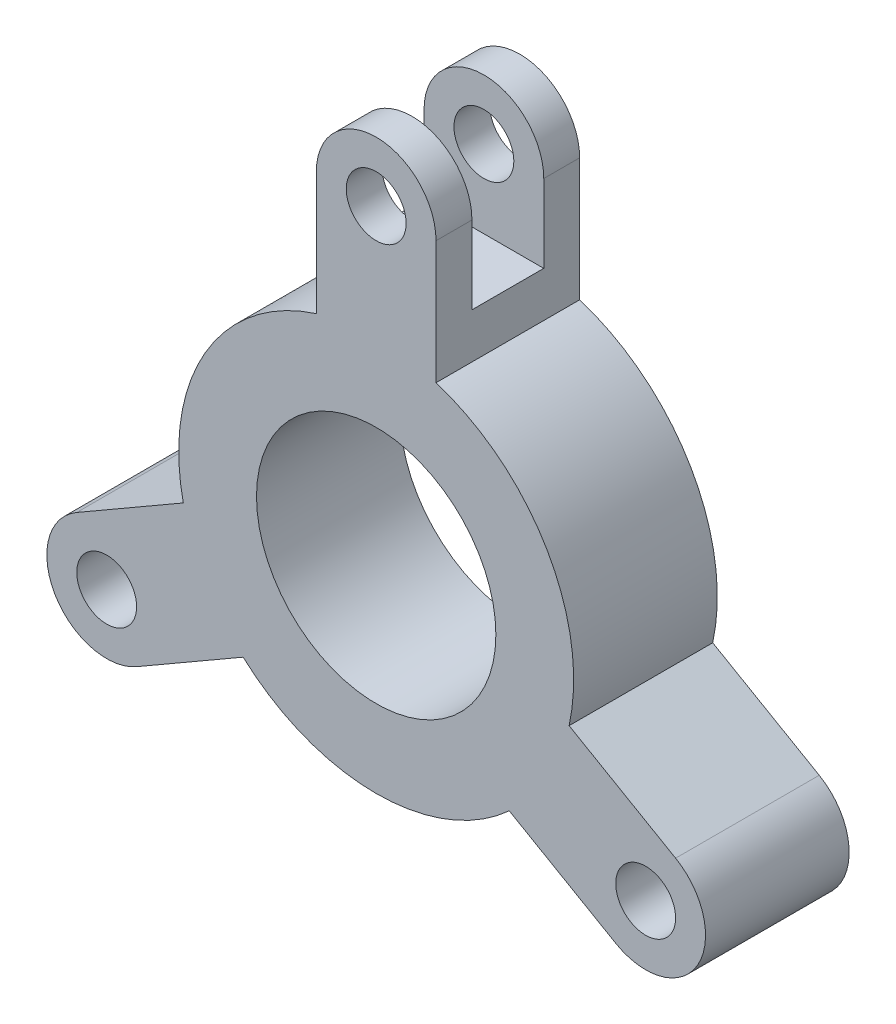
ISO-10303-21;
HEADER;
FILE_DESCRIPTION(('STEP AP214'),'2;1');
FILE_NAME('part.step','',(''),(''),'','','');
FILE_SCHEMA(('AUTOMOTIVE_DESIGN { 1 0 10303 214 1 1 1 1 }'));
ENDSEC;
DATA;
#1=APPLICATION_CONTEXT('core data for automotive mechanical design processes');
#2=APPLICATION_PROTOCOL_DEFINITION('international standard','automotive_design',2000,#1);
#3=PRODUCT_CONTEXT('',#1,'mechanical');
#4=PRODUCT('Part','Part','',(#3));
#5=PRODUCT_RELATED_PRODUCT_CATEGORY('part','',(#4));
#6=PRODUCT_DEFINITION_FORMATION('','',#4);
#7=PRODUCT_DEFINITION_CONTEXT('part definition',#1,'design');
#8=PRODUCT_DEFINITION('design','',#6,#7);
#9=PRODUCT_DEFINITION_SHAPE('','',#8);
#10=(LENGTH_UNIT() NAMED_UNIT(*) SI_UNIT(.MILLI.,.METRE.));
#11=(NAMED_UNIT(*) PLANE_ANGLE_UNIT() SI_UNIT($,.RADIAN.));
#12=(NAMED_UNIT(*) SI_UNIT($,.STERADIAN.) SOLID_ANGLE_UNIT());
#13=UNCERTAINTY_MEASURE_WITH_UNIT(LENGTH_MEASURE(1.E-05),#10,'distance_accuracy_value','');
#14=(GEOMETRIC_REPRESENTATION_CONTEXT(3) GLOBAL_UNCERTAINTY_ASSIGNED_CONTEXT((#13)) GLOBAL_UNIT_ASSIGNED_CONTEXT((#10,
#11,#12)) REPRESENTATION_CONTEXT('',''));
#15=CARTESIAN_POINT('',(0.,0.,0.));
#16=DIRECTION('',(0.,0.,1.));
#17=DIRECTION('',(1.,0.,0.));
#18=AXIS2_PLACEMENT_3D('',#15,#16,#17);
#19=CARTESIAN_POINT('',(-5.,0.,-6.));
#20=DIRECTION('',(1.,0.,0.));
#21=DIRECTION('',(0.,0.,-1.));
#22=AXIS2_PLACEMENT_3D('',#19,#20,#21);
#23=PLANE('',#22);
#24=DIRECTION('',(0.,1.,0.));
#25=VECTOR('',#24,1.);
#26=CARTESIAN_POINT('',(-5.,0.,3.));
#27=LINE('',#26,#25);
#28=CARTESIAN_POINT('',(-5.,19.5,3.));
#29=VERTEX_POINT('',#28);
#30=CARTESIAN_POINT('',(-5.,26.,3.));
#31=VERTEX_POINT('',#30);
#32=EDGE_CURVE('E166',#29,#31,#27,.T.);
#33=ORIENTED_EDGE('',*,*,#32,.F.);
#34=DIRECTION('',(0.,0.,1.));
#35=VECTOR('',#34,1.);
#36=CARTESIAN_POINT('',(-5.,19.5,-6.));
#37=LINE('',#36,#35);
#38=CARTESIAN_POINT('',(-5.,19.5,-3.));
#39=VERTEX_POINT('',#38);
#40=EDGE_CURVE('E159',#39,#29,#37,.T.);
#41=ORIENTED_EDGE('',*,*,#40,.F.);
#42=DIRECTION('',(0.,1.,0.));
#43=VECTOR('',#42,1.);
#44=CARTESIAN_POINT('',(-5.,0.,-3.));
#45=LINE('',#44,#43);
#46=CARTESIAN_POINT('',(-5.,26.,-3.));
#47=VERTEX_POINT('',#46);
#48=EDGE_CURVE('E146',#39,#47,#45,.T.);
#49=ORIENTED_EDGE('',*,*,#48,.T.);
#50=DIRECTION('',(0.,0.,1.));
#51=VECTOR('',#50,1.);
#52=CARTESIAN_POINT('',(-5.,26.,-6.));
#53=LINE('',#52,#51);
#54=CARTESIAN_POINT('',(-5.,26.,-6.));
#55=VERTEX_POINT('',#54);
#56=EDGE_CURVE('E266',#55,#47,#53,.T.);
#57=ORIENTED_EDGE('',*,*,#56,.F.);
#58=DIRECTION('',(0.,1.,0.));
#59=VECTOR('',#58,1.);
#60=CARTESIAN_POINT('',(-5.,0.,-6.));
#61=LINE('',#60,#59);
#62=CARTESIAN_POINT('',(-5.,15.7241851935164,-6.));
#63=VERTEX_POINT('',#62);
#64=EDGE_CURVE('E250',#63,#55,#61,.T.);
#65=ORIENTED_EDGE('',*,*,#64,.F.);
#66=DIRECTION('',(0.,0.,1.));
#67=VECTOR('',#66,1.);
#68=CARTESIAN_POINT('',(-5.,15.7241851935164,-6.));
#69=LINE('',#68,#67);
#70=CARTESIAN_POINT('',(-5.,15.7241851935164,6.));
#71=VERTEX_POINT('',#70);
#72=EDGE_CURVE('E43',#63,#71,#69,.T.);
#73=ORIENTED_EDGE('',*,*,#72,.T.);
#74=DIRECTION('',(0.,1.,0.));
#75=VECTOR('',#74,1.);
#76=CARTESIAN_POINT('',(-5.,0.,6.));
#77=LINE('',#76,#75);
#78=CARTESIAN_POINT('',(-5.,26.,6.));
#79=VERTEX_POINT('',#78);
#80=EDGE_CURVE('E205',#71,#79,#77,.T.);
#81=ORIENTED_EDGE('',*,*,#80,.T.);
#82=EDGE_CURVE('E268',#31,#79,#53,.T.);
#83=ORIENTED_EDGE('',*,*,#82,.F.);
#84=EDGE_LOOP('',(#33,#41,#49,#57,#65,#73,#81,#83));
#85=FACE_BOUND('',#84,.T.);
#86=ADVANCED_FACE('F35',(#85),#23,.F.);
#87=CARTESIAN_POINT('',(0.,26.,-6.));
#88=DIRECTION('',(0.,0.,1.));
#89=DIRECTION('',(1.,0.,0.));
#90=AXIS2_PLACEMENT_3D('',#87,#88,#89);
#91=CYLINDRICAL_SURFACE('',#90,5.);
#92=DIRECTION('',(0.,0.,1.));
#93=VECTOR('',#92,1.);
#94=CARTESIAN_POINT('',(5.,26.,-6.));
#95=LINE('',#94,#93);
#96=CARTESIAN_POINT('',(5.,26.,3.));
#97=VERTEX_POINT('',#96);
#98=CARTESIAN_POINT('',(5.,26.,6.));
#99=VERTEX_POINT('',#98);
#100=EDGE_CURVE('E272',#97,#99,#95,.T.);
#101=ORIENTED_EDGE('',*,*,#100,.F.);
#102=CARTESIAN_POINT('',(0.,26.,3.));
#103=DIRECTION('',(0.,0.,-1.));
#104=DIRECTION('',(-1.,0.,0.));
#105=AXIS2_PLACEMENT_3D('',#102,#103,#104);
#106=CIRCLE('',#105,5.);
#107=EDGE_CURVE('E172',#97,#31,#106,.F.);
#108=ORIENTED_EDGE('',*,*,#107,.T.);
#109=ORIENTED_EDGE('',*,*,#82,.T.);
#110=CARTESIAN_POINT('',(0.,26.,6.));
#111=DIRECTION('',(0.,0.,1.));
#112=DIRECTION('',(1.,0.,0.));
#113=AXIS2_PLACEMENT_3D('',#110,#111,#112);
#114=CIRCLE('',#113,5.);
#115=EDGE_CURVE('E202',#99,#79,#114,.T.);
#116=ORIENTED_EDGE('',*,*,#115,.F.);
#117=EDGE_LOOP('',(#101,#108,#109,#116));
#118=FACE_BOUND('',#117,.T.);
#119=ADVANCED_FACE('F326',(#118),#91,.T.);
#120=CARTESIAN_POINT('',(5.,0.,-6.));
#121=DIRECTION('',(1.,0.,0.));
#122=DIRECTION('',(0.,0.,-1.));
#123=AXIS2_PLACEMENT_3D('',#120,#121,#122);
#124=PLANE('',#123);
#125=DIRECTION('',(0.,0.,1.));
#126=VECTOR('',#125,1.);
#127=CARTESIAN_POINT('',(5.,19.5,-6.));
#128=LINE('',#127,#126);
#129=CARTESIAN_POINT('',(5.,19.5,-3.));
#130=VERTEX_POINT('',#129);
#131=CARTESIAN_POINT('',(5.,19.5,3.));
#132=VERTEX_POINT('',#131);
#133=EDGE_CURVE('E11',#130,#132,#128,.T.);
#134=ORIENTED_EDGE('',*,*,#133,.T.);
#135=DIRECTION('',(0.,1.,0.));
#136=VECTOR('',#135,1.);
#137=CARTESIAN_POINT('',(5.,0.,3.));
#138=LINE('',#137,#136);
#139=EDGE_CURVE('E294',#132,#97,#138,.T.);
#140=ORIENTED_EDGE('',*,*,#139,.T.);
#141=ORIENTED_EDGE('',*,*,#100,.T.);
#142=DIRECTION('',(0.,1.,0.));
#143=VECTOR('',#142,1.);
#144=CARTESIAN_POINT('',(5.,0.,6.));
#145=LINE('',#144,#143);
#146=CARTESIAN_POINT('',(5.,15.7241851935164,6.));
#147=VERTEX_POINT('',#146);
#148=EDGE_CURVE('E199',#147,#99,#145,.T.);
#149=ORIENTED_EDGE('',*,*,#148,.F.);
#150=DIRECTION('',(0.,0.,1.));
#151=VECTOR('',#150,1.);
#152=CARTESIAN_POINT('',(5.,15.7241851935164,-6.));
#153=LINE('',#152,#151);
#154=CARTESIAN_POINT('',(5.,15.7241851935164,-6.));
#155=VERTEX_POINT('',#154);
#156=EDGE_CURVE('E273',#155,#147,#153,.T.);
#157=ORIENTED_EDGE('',*,*,#156,.F.);
#158=DIRECTION('',(0.,1.,0.));
#159=VECTOR('',#158,1.);
#160=CARTESIAN_POINT('',(5.,0.,-6.));
#161=LINE('',#160,#159);
#162=CARTESIAN_POINT('',(5.,26.,-6.));
#163=VERTEX_POINT('',#162);
#164=EDGE_CURVE('E244',#155,#163,#161,.T.);
#165=ORIENTED_EDGE('',*,*,#164,.T.);
#166=CARTESIAN_POINT('',(5.,26.,-3.));
#167=VERTEX_POINT('',#166);
#168=EDGE_CURVE('E269',#163,#167,#95,.T.);
#169=ORIENTED_EDGE('',*,*,#168,.T.);
#170=DIRECTION('',(0.,1.,0.));
#171=VECTOR('',#170,1.);
#172=CARTESIAN_POINT('',(5.,0.,-3.));
#173=LINE('',#172,#171);
#174=EDGE_CURVE('E292',#130,#167,#173,.T.);
#175=ORIENTED_EDGE('',*,*,#174,.F.);
#176=EDGE_LOOP('',(#134,#140,#141,#149,#157,#165,#169,#175));
#177=FACE_BOUND('',#176,.T.);
#178=ADVANCED_FACE('F306',(#177),#124,.T.);
#179=CARTESIAN_POINT('',(0.,26.,-6.));
#180=DIRECTION('',(0.,0.,1.));
#181=DIRECTION('',(1.,0.,0.));
#182=AXIS2_PLACEMENT_3D('',#179,#180,#181);
#183=CYLINDRICAL_SURFACE('',#182,2.5);
#184=CARTESIAN_POINT('',(0.,26.,6.));
#185=DIRECTION('',(0.,0.,1.));
#186=DIRECTION('',(1.,0.,0.));
#187=AXIS2_PLACEMENT_3D('',#184,#185,#186);
#188=CIRCLE('',#187,2.5);
#189=CARTESIAN_POINT('',(2.5,26.,6.));
#190=VERTEX_POINT('',#189);
#191=EDGE_CURVE('E211',#190,#190,#188,.T.);
#192=ORIENTED_EDGE('',*,*,#191,.T.);
#193=EDGE_LOOP('',(#192));
#194=FACE_BOUND('',#193,.T.);
#195=CARTESIAN_POINT('',(0.,26.,3.));
#196=DIRECTION('',(0.,0.,-1.));
#197=DIRECTION('',(-1.,0.,0.));
#198=AXIS2_PLACEMENT_3D('',#195,#196,#197);
#199=CIRCLE('',#198,2.5);
#200=CARTESIAN_POINT('',(-2.5,26.,3.));
#201=VERTEX_POINT('',#200);
#202=EDGE_CURVE('E154',#201,#201,#199,.F.);
#203=ORIENTED_EDGE('',*,*,#202,.F.);
#204=EDGE_LOOP('',(#203));
#205=FACE_BOUND('',#204,.T.);
#206=ADVANCED_FACE('F351',(#194,#205),#183,.F.);
#207=CARTESIAN_POINT('',(0.,0.,-6.));
#208=DIRECTION('',(0.,0.,1.));
#209=DIRECTION('',(1.,0.,0.));
#210=AXIS2_PLACEMENT_3D('',#207,#208,#209);
#211=CYLINDRICAL_SURFACE('',#210,16.5);
#212=DIRECTION('',(0.,0.,1.));
#213=VECTOR('',#212,1.);
#214=CARTESIAN_POINT('',(-16.1175438313963,-3.531965577836,-6.));
#215=LINE('',#214,#213);
#216=CARTESIAN_POINT('',(-16.1175438313963,-3.531965577836,-6.));
#217=VERTEX_POINT('',#216);
#218=CARTESIAN_POINT('',(-16.1175438313963,-3.531965577836,6.));
#219=VERTEX_POINT('',#218);
#220=EDGE_CURVE('E264',#217,#219,#215,.T.);
#221=ORIENTED_EDGE('',*,*,#220,.T.);
#222=CARTESIAN_POINT('',(0.,0.,6.));
#223=DIRECTION('',(0.,0.,1.));
#224=DIRECTION('',(1.,0.,0.));
#225=AXIS2_PLACEMENT_3D('',#222,#223,#224);
#226=CIRCLE('',#225,16.5);
#227=EDGE_CURVE('E167',#71,#219,#226,.T.);
#228=ORIENTED_EDGE('',*,*,#227,.F.);
#229=ORIENTED_EDGE('',*,*,#72,.F.);
#230=CARTESIAN_POINT('',(0.,0.,-6.));
#231=DIRECTION('',(0.,0.,1.));
#232=DIRECTION('',(1.,0.,0.));
#233=AXIS2_PLACEMENT_3D('',#230,#231,#232);
#234=CIRCLE('',#233,16.5);
#235=EDGE_CURVE('E220',#63,#217,#234,.T.);
#236=ORIENTED_EDGE('',*,*,#235,.T.);
#237=EDGE_LOOP('',(#221,#228,#229,#236));
#238=FACE_BOUND('',#237,.T.);
#239=ADVANCED_FACE('F37',(#238),#211,.T.);
#240=CARTESIAN_POINT('',(0.,26.,-3.));
#241=DIRECTION('',(0.,0.,-1.));
#242=DIRECTION('',(-1.,0.,0.));
#243=AXIS2_PLACEMENT_3D('',#240,#241,#242);
#244=CIRCLE('',#243,5.);
#245=EDGE_CURVE('E149',#167,#47,#244,.F.);
#246=ORIENTED_EDGE('',*,*,#245,.F.);
#247=ORIENTED_EDGE('',*,*,#168,.F.);
#248=CARTESIAN_POINT('',(0.,26.,-6.));
#249=DIRECTION('',(0.,0.,1.));
#250=DIRECTION('',(1.,0.,0.));
#251=AXIS2_PLACEMENT_3D('',#248,#249,#250);
#252=CIRCLE('',#251,5.);
#253=EDGE_CURVE('E247',#163,#55,#252,.T.);
#254=ORIENTED_EDGE('',*,*,#253,.T.);
#255=ORIENTED_EDGE('',*,*,#56,.T.);
#256=EDGE_LOOP('',(#246,#247,#254,#255));
#257=FACE_BOUND('',#256,.T.);
#258=ADVANCED_FACE('F308',(#257),#91,.T.);
#259=CARTESIAN_POINT('',(0.,0.,-6.));
#260=DIRECTION('',(0.,0.,1.));
#261=DIRECTION('',(1.,0.,0.));
#262=AXIS2_PLACEMENT_3D('',#259,#260,#261);
#263=CYLINDRICAL_SURFACE('',#262,16.5);
#264=ORIENTED_EDGE('',*,*,#156,.T.);
#265=CARTESIAN_POINT('',(0.,0.,6.));
#266=DIRECTION('',(0.,0.,1.));
#267=DIRECTION('',(1.,0.,0.));
#268=AXIS2_PLACEMENT_3D('',#265,#266,#267);
#269=CIRCLE('',#268,16.5);
#270=CARTESIAN_POINT('',(16.1175438313963,-3.53196557783599,6.));
#271=VERTEX_POINT('',#270);
#272=EDGE_CURVE('E196',#271,#147,#269,.T.);
#273=ORIENTED_EDGE('',*,*,#272,.F.);
#274=DIRECTION('',(0.,0.,1.));
#275=VECTOR('',#274,1.);
#276=CARTESIAN_POINT('',(16.1175438313963,-3.53196557783599,-6.));
#277=LINE('',#276,#275);
#278=CARTESIAN_POINT('',(16.1175438313963,-3.53196557783599,-6.));
#279=VERTEX_POINT('',#278);
#280=EDGE_CURVE('E275',#279,#271,#277,.T.);
#281=ORIENTED_EDGE('',*,*,#280,.F.);
#282=CARTESIAN_POINT('',(0.,0.,-6.));
#283=DIRECTION('',(0.,0.,1.));
#284=DIRECTION('',(1.,0.,0.));
#285=AXIS2_PLACEMENT_3D('',#282,#283,#284);
#286=CIRCLE('',#285,16.5);
#287=EDGE_CURVE('E241',#279,#155,#286,.T.);
#288=ORIENTED_EDGE('',*,*,#287,.T.);
#289=EDGE_LOOP('',(#264,#273,#281,#288));
#290=FACE_BOUND('',#289,.T.);
#291=ADVANCED_FACE('F348',(#290),#263,.T.);
#292=CARTESIAN_POINT('',(2.5,4.3301270189222,-6.));
#293=DIRECTION('',(-0.5,-0.866025403784439,0.));
#294=DIRECTION('',(0.866025403784439,-0.5,0.));
#295=AXIS2_PLACEMENT_3D('',#292,#293,#294);
#296=PLANE('',#295);
#297=ORIENTED_EDGE('',*,*,#280,.T.);
#298=DIRECTION('',(0.866025403784439,-0.5,0.));
#299=VECTOR('',#298,1.);
#300=CARTESIAN_POINT('',(2.5,4.3301270189222,6.));
#301=LINE('',#300,#299);
#302=CARTESIAN_POINT('',(25.0166604983954,-8.6698729810778,6.));
#303=VERTEX_POINT('',#302);
#304=EDGE_CURVE('E193',#271,#303,#301,.T.);
#305=ORIENTED_EDGE('',*,*,#304,.T.);
#306=DIRECTION('',(0.,0.,1.));
#307=VECTOR('',#306,1.);
#308=CARTESIAN_POINT('',(25.0166604983954,-8.6698729810778,-6.));
#309=LINE('',#308,#307);
#310=CARTESIAN_POINT('',(25.0166604983954,-8.6698729810778,-6.));
#311=VERTEX_POINT('',#310);
#312=EDGE_CURVE('E277',#311,#303,#309,.T.);
#313=ORIENTED_EDGE('',*,*,#312,.F.);
#314=DIRECTION('',(0.866025403784439,-0.5,0.));
#315=VECTOR('',#314,1.);
#316=CARTESIAN_POINT('',(2.5,4.3301270189222,-6.));
#317=LINE('',#316,#315);
#318=EDGE_CURVE('E239',#279,#311,#317,.T.);
#319=ORIENTED_EDGE('',*,*,#318,.F.);
#320=EDGE_LOOP('',(#297,#305,#313,#319));
#321=FACE_BOUND('',#320,.T.);
#322=ADVANCED_FACE('F354',(#321),#296,.F.);
#323=CARTESIAN_POINT('',(22.5166604983954,-13.,-6.));
#324=DIRECTION('',(0.,0.,1.));
#325=DIRECTION('',(1.,0.,0.));
#326=AXIS2_PLACEMENT_3D('',#323,#324,#325);
#327=CYLINDRICAL_SURFACE('',#326,5.);
#328=ORIENTED_EDGE('',*,*,#312,.T.);
#329=CARTESIAN_POINT('',(22.5166604983954,-13.,6.));
#330=DIRECTION('',(0.,0.,1.));
#331=DIRECTION('',(1.,0.,0.));
#332=AXIS2_PLACEMENT_3D('',#329,#330,#331);
#333=CIRCLE('',#332,5.);
#334=CARTESIAN_POINT('',(20.0166604983954,-17.3301270189222,6.));
#335=VERTEX_POINT('',#334);
#336=EDGE_CURVE('E190',#335,#303,#333,.T.);
#337=ORIENTED_EDGE('',*,*,#336,.F.);
#338=DIRECTION('',(0.,0.,1.));
#339=VECTOR('',#338,1.);
#340=CARTESIAN_POINT('',(20.0166604983954,-17.3301270189222,-6.));
#341=LINE('',#340,#339);
#342=CARTESIAN_POINT('',(20.0166604983954,-17.3301270189222,-6.));
#343=VERTEX_POINT('',#342);
#344=EDGE_CURVE('E279',#343,#335,#341,.T.);
#345=ORIENTED_EDGE('',*,*,#344,.F.);
#346=CARTESIAN_POINT('',(22.5166604983954,-13.,-6.));
#347=DIRECTION('',(0.,0.,1.));
#348=DIRECTION('',(1.,0.,0.));
#349=AXIS2_PLACEMENT_3D('',#346,#347,#348);
#350=CIRCLE('',#349,5.);
#351=EDGE_CURVE('E236',#343,#311,#350,.T.);
#352=ORIENTED_EDGE('',*,*,#351,.T.);
#353=EDGE_LOOP('',(#328,#337,#345,#352));
#354=FACE_BOUND('',#353,.T.);
#355=ADVANCED_FACE('F358',(#354),#327,.T.);
#356=CARTESIAN_POINT('',(-2.5,-4.33012701892219,-6.));
#357=DIRECTION('',(-0.5,-0.866025403784439,0.));
#358=DIRECTION('',(0.866025403784439,-0.5,0.));
#359=AXIS2_PLACEMENT_3D('',#356,#357,#358);
#360=PLANE('',#359);
#361=ORIENTED_EDGE('',*,*,#344,.T.);
#362=DIRECTION('',(0.866025403784439,-0.5,0.));
#363=VECTOR('',#362,1.);
#364=CARTESIAN_POINT('',(-2.5,-4.33012701892219,6.));
#365=LINE('',#364,#363);
#366=CARTESIAN_POINT('',(11.1175438313963,-12.1922196156804,6.));
#367=VERTEX_POINT('',#366);
#368=EDGE_CURVE('E187',#367,#335,#365,.T.);
#369=ORIENTED_EDGE('',*,*,#368,.F.);
#370=DIRECTION('',(0.,0.,1.));
#371=VECTOR('',#370,1.);
#372=CARTESIAN_POINT('',(11.1175438313963,-12.1922196156804,-6.));
#373=LINE('',#372,#371);
#374=CARTESIAN_POINT('',(11.1175438313963,-12.1922196156804,-6.));
#375=VERTEX_POINT('',#374);
#376=EDGE_CURVE('E281',#375,#367,#373,.T.);
#377=ORIENTED_EDGE('',*,*,#376,.F.);
#378=DIRECTION('',(0.866025403784439,-0.5,0.));
#379=VECTOR('',#378,1.);
#380=CARTESIAN_POINT('',(-2.5,-4.33012701892219,-6.));
#381=LINE('',#380,#379);
#382=EDGE_CURVE('E233',#375,#343,#381,.T.);
#383=ORIENTED_EDGE('',*,*,#382,.T.);
#384=EDGE_LOOP('',(#361,#369,#377,#383));
#385=FACE_BOUND('',#384,.T.);
#386=ADVANCED_FACE('F362',(#385),#360,.T.);
#387=CARTESIAN_POINT('',(0.,0.,-6.));
#388=DIRECTION('',(0.,0.,1.));
#389=DIRECTION('',(1.,0.,0.));
#390=AXIS2_PLACEMENT_3D('',#387,#388,#389);
#391=CYLINDRICAL_SURFACE('',#390,16.5);
#392=ORIENTED_EDGE('',*,*,#376,.T.);
#393=CARTESIAN_POINT('',(0.,0.,6.));
#394=DIRECTION('',(0.,0.,1.));
#395=DIRECTION('',(1.,0.,0.));
#396=AXIS2_PLACEMENT_3D('',#393,#394,#395);
#397=CIRCLE('',#396,16.5);
#398=CARTESIAN_POINT('',(-11.1175438313963,-12.1922196156804,6.));
#399=VERTEX_POINT('',#398);
#400=EDGE_CURVE('E184',#399,#367,#397,.T.);
#401=ORIENTED_EDGE('',*,*,#400,.F.);
#402=DIRECTION('',(0.,0.,1.));
#403=VECTOR('',#402,1.);
#404=CARTESIAN_POINT('',(-11.1175438313963,-12.1922196156804,-6.));
#405=LINE('',#404,#403);
#406=CARTESIAN_POINT('',(-11.1175438313963,-12.1922196156804,-6.));
#407=VERTEX_POINT('',#406);
#408=EDGE_CURVE('E283',#407,#399,#405,.T.);
#409=ORIENTED_EDGE('',*,*,#408,.F.);
#410=CARTESIAN_POINT('',(0.,0.,-6.));
#411=DIRECTION('',(0.,0.,1.));
#412=DIRECTION('',(1.,0.,0.));
#413=AXIS2_PLACEMENT_3D('',#410,#411,#412);
#414=CIRCLE('',#413,16.5);
#415=EDGE_CURVE('E230',#407,#375,#414,.T.);
#416=ORIENTED_EDGE('',*,*,#415,.T.);
#417=EDGE_LOOP('',(#392,#401,#409,#416));
#418=FACE_BOUND('',#417,.T.);
#419=ADVANCED_FACE('F366',(#418),#391,.T.);
#420=CARTESIAN_POINT('',(2.5,-4.3301270189222,-6.));
#421=DIRECTION('',(-0.5,0.866025403784439,0.));
#422=DIRECTION('',(-0.866025403784439,-0.5,0.));
#423=AXIS2_PLACEMENT_3D('',#420,#421,#422);
#424=PLANE('',#423);
#425=ORIENTED_EDGE('',*,*,#408,.T.);
#426=DIRECTION('',(-0.866025403784439,-0.5,0.));
#427=VECTOR('',#426,1.);
#428=CARTESIAN_POINT('',(2.5,-4.3301270189222,6.));
#429=LINE('',#428,#427);
#430=CARTESIAN_POINT('',(-20.0166604983954,-17.3301270189222,6.));
#431=VERTEX_POINT('',#430);
#432=EDGE_CURVE('E181',#399,#431,#429,.T.);
#433=ORIENTED_EDGE('',*,*,#432,.T.);
#434=DIRECTION('',(0.,0.,1.));
#435=VECTOR('',#434,1.);
#436=CARTESIAN_POINT('',(-20.0166604983954,-17.3301270189222,-6.));
#437=LINE('',#436,#435);
#438=CARTESIAN_POINT('',(-20.0166604983954,-17.3301270189222,-6.));
#439=VERTEX_POINT('',#438);
#440=EDGE_CURVE('E285',#439,#431,#437,.T.);
#441=ORIENTED_EDGE('',*,*,#440,.F.);
#442=DIRECTION('',(-0.866025403784439,-0.5,0.));
#443=VECTOR('',#442,1.);
#444=CARTESIAN_POINT('',(2.5,-4.3301270189222,-6.));
#445=LINE('',#444,#443);
#446=EDGE_CURVE('E228',#407,#439,#445,.T.);
#447=ORIENTED_EDGE('',*,*,#446,.F.);
#448=EDGE_LOOP('',(#425,#433,#441,#447));
#449=FACE_BOUND('',#448,.T.);
#450=ADVANCED_FACE('F370',(#449),#424,.F.);
#451=CARTESIAN_POINT('',(-22.5166604983954,-13.,-6.));
#452=DIRECTION('',(0.,0.,1.));
#453=DIRECTION('',(1.,0.,0.));
#454=AXIS2_PLACEMENT_3D('',#451,#452,#453);
#455=CYLINDRICAL_SURFACE('',#454,5.);
#456=ORIENTED_EDGE('',*,*,#440,.T.);
#457=CARTESIAN_POINT('',(-22.5166604983954,-13.,6.));
#458=DIRECTION('',(0.,0.,1.));
#459=DIRECTION('',(1.,0.,0.));
#460=AXIS2_PLACEMENT_3D('',#457,#458,#459);
#461=CIRCLE('',#460,5.);
#462=CARTESIAN_POINT('',(-25.0166604983954,-8.6698729810778,6.));
#463=VERTEX_POINT('',#462);
#464=EDGE_CURVE('E178',#463,#431,#461,.T.);
#465=ORIENTED_EDGE('',*,*,#464,.F.);
#466=DIRECTION('',(0.,0.,1.));
#467=VECTOR('',#466,1.);
#468=CARTESIAN_POINT('',(-25.0166604983954,-8.6698729810778,-6.));
#469=LINE('',#468,#467);
#470=CARTESIAN_POINT('',(-25.0166604983954,-8.6698729810778,-6.));
#471=VERTEX_POINT('',#470);
#472=EDGE_CURVE('E287',#471,#463,#469,.T.);
#473=ORIENTED_EDGE('',*,*,#472,.F.);
#474=CARTESIAN_POINT('',(-22.5166604983954,-13.,-6.));
#475=DIRECTION('',(0.,0.,1.));
#476=DIRECTION('',(1.,0.,0.));
#477=AXIS2_PLACEMENT_3D('',#474,#475,#476);
#478=CIRCLE('',#477,5.);
#479=EDGE_CURVE('E225',#471,#439,#478,.T.);
#480=ORIENTED_EDGE('',*,*,#479,.T.);
#481=EDGE_LOOP('',(#456,#465,#473,#480));
#482=FACE_BOUND('',#481,.T.);
#483=ADVANCED_FACE('F374',(#482),#455,.T.);
#484=CARTESIAN_POINT('',(22.5166604983954,-13.,-6.));
#485=DIRECTION('',(0.,0.,1.));
#486=DIRECTION('',(1.,0.,0.));
#487=AXIS2_PLACEMENT_3D('',#484,#485,#486);
#488=CYLINDRICAL_SURFACE('',#487,2.5);
#489=CARTESIAN_POINT('',(22.5166604983954,-13.,-6.));
#490=DIRECTION('',(0.,0.,1.));
#491=DIRECTION('',(1.,0.,0.));
#492=AXIS2_PLACEMENT_3D('',#489,#490,#491);
#493=CIRCLE('',#492,2.5);
#494=CARTESIAN_POINT('',(25.0166604983954,-13.,-6.));
#495=VERTEX_POINT('',#494);
#496=EDGE_CURVE('E258',#495,#495,#493,.T.);
#497=ORIENTED_EDGE('',*,*,#496,.F.);
#498=EDGE_LOOP('',(#497));
#499=FACE_BOUND('',#498,.T.);
#500=CARTESIAN_POINT('',(22.5166604983954,-13.,6.));
#501=DIRECTION('',(0.,0.,1.));
#502=DIRECTION('',(1.,0.,0.));
#503=AXIS2_PLACEMENT_3D('',#500,#501,#502);
#504=CIRCLE('',#503,2.5);
#505=CARTESIAN_POINT('',(25.0166604983954,-13.,6.));
#506=VERTEX_POINT('',#505);
#507=EDGE_CURVE('E214',#506,#506,#504,.T.);
#508=ORIENTED_EDGE('',*,*,#507,.T.);
#509=EDGE_LOOP('',(#508));
#510=FACE_BOUND('',#509,.T.);
#511=ADVANCED_FACE('F377',(#499,#510),#488,.F.);
#512=CARTESIAN_POINT('',(0.,26.,-3.));
#513=DIRECTION('',(0.,0.,-1.));
#514=DIRECTION('',(-1.,0.,0.));
#515=AXIS2_PLACEMENT_3D('',#512,#513,#514);
#516=CIRCLE('',#515,2.5);
#517=CARTESIAN_POINT('',(-2.5,26.,-3.));
#518=VERTEX_POINT('',#517);
#519=EDGE_CURVE('E290',#518,#518,#516,.F.);
#520=ORIENTED_EDGE('',*,*,#519,.T.);
#521=EDGE_LOOP('',(#520));
#522=FACE_BOUND('',#521,.T.);
#523=CARTESIAN_POINT('',(0.,26.,-6.));
#524=DIRECTION('',(0.,0.,1.));
#525=DIRECTION('',(1.,0.,0.));
#526=AXIS2_PLACEMENT_3D('',#523,#524,#525);
#527=CIRCLE('',#526,2.5);
#528=CARTESIAN_POINT('',(2.5,26.,-6.));
#529=VERTEX_POINT('',#528);
#530=EDGE_CURVE('E255',#529,#529,#527,.T.);
#531=ORIENTED_EDGE('',*,*,#530,.F.);
#532=EDGE_LOOP('',(#531));
#533=FACE_BOUND('',#532,.T.);
#534=ADVANCED_FACE('F387',(#522,#533),#183,.F.);
#535=CARTESIAN_POINT('',(0.,0.,-6.));
#536=DIRECTION('',(0.,0.,1.));
#537=DIRECTION('',(1.,0.,0.));
#538=AXIS2_PLACEMENT_3D('',#535,#536,#537);
#539=CYLINDRICAL_SURFACE('',#538,10.);
#540=CARTESIAN_POINT('',(0.,0.,-6.));
#541=DIRECTION('',(0.,0.,1.));
#542=DIRECTION('',(1.,0.,0.));
#543=AXIS2_PLACEMENT_3D('',#540,#541,#542);
#544=CIRCLE('',#543,10.);
#545=CARTESIAN_POINT('',(10.,0.,-6.));
#546=VERTEX_POINT('',#545);
#547=EDGE_CURVE('E252',#546,#546,#544,.T.);
#548=ORIENTED_EDGE('',*,*,#547,.F.);
#549=EDGE_LOOP('',(#548));
#550=FACE_BOUND('',#549,.T.);
#551=CARTESIAN_POINT('',(0.,0.,6.));
#552=DIRECTION('',(0.,0.,1.));
#553=DIRECTION('',(1.,0.,0.));
#554=AXIS2_PLACEMENT_3D('',#551,#552,#553);
#555=CIRCLE('',#554,10.);
#556=CARTESIAN_POINT('',(10.,0.,6.));
#557=VERTEX_POINT('',#556);
#558=EDGE_CURVE('E208',#557,#557,#555,.T.);
#559=ORIENTED_EDGE('',*,*,#558,.T.);
#560=EDGE_LOOP('',(#559));
#561=FACE_BOUND('',#560,.T.);
#562=ADVANCED_FACE('F344',(#550,#561),#539,.F.);
#563=CARTESIAN_POINT('',(-2.5,4.33012701892219,-6.));
#564=DIRECTION('',(-0.5,0.866025403784439,0.));
#565=DIRECTION('',(-0.866025403784439,-0.5,0.));
#566=AXIS2_PLACEMENT_3D('',#563,#564,#565);
#567=PLANE('',#566);
#568=ORIENTED_EDGE('',*,*,#472,.T.);
#569=DIRECTION('',(-0.866025403784439,-0.5,0.));
#570=VECTOR('',#569,1.);
#571=CARTESIAN_POINT('',(-2.5,4.33012701892219,6.));
#572=LINE('',#571,#570);
#573=EDGE_CURVE('E170',#219,#463,#572,.T.);
#574=ORIENTED_EDGE('',*,*,#573,.F.);
#575=ORIENTED_EDGE('',*,*,#220,.F.);
#576=DIRECTION('',(-0.866025403784439,-0.5,0.));
#577=VECTOR('',#576,1.);
#578=CARTESIAN_POINT('',(-2.5,4.33012701892219,-6.));
#579=LINE('',#578,#577);
#580=EDGE_CURVE('E222',#217,#471,#579,.T.);
#581=ORIENTED_EDGE('',*,*,#580,.T.);
#582=EDGE_LOOP('',(#568,#574,#575,#581));
#583=FACE_BOUND('',#582,.T.);
#584=ADVANCED_FACE('F319',(#583),#567,.T.);
#585=CARTESIAN_POINT('',(-22.5166604983954,-13.,-6.));
#586=DIRECTION('',(0.,0.,1.));
#587=DIRECTION('',(1.,0.,0.));
#588=AXIS2_PLACEMENT_3D('',#585,#586,#587);
#589=CYLINDRICAL_SURFACE('',#588,2.5);
#590=CARTESIAN_POINT('',(-22.5166604983954,-13.,-6.));
#591=DIRECTION('',(0.,0.,1.));
#592=DIRECTION('',(1.,0.,0.));
#593=AXIS2_PLACEMENT_3D('',#590,#591,#592);
#594=CIRCLE('',#593,2.5);
#595=CARTESIAN_POINT('',(-20.0166604983954,-13.,-6.));
#596=VERTEX_POINT('',#595);
#597=EDGE_CURVE('E261',#596,#596,#594,.T.);
#598=ORIENTED_EDGE('',*,*,#597,.F.);
#599=EDGE_LOOP('',(#598));
#600=FACE_BOUND('',#599,.T.);
#601=CARTESIAN_POINT('',(-22.5166604983954,-13.,6.));
#602=DIRECTION('',(0.,0.,1.));
#603=DIRECTION('',(1.,0.,0.));
#604=AXIS2_PLACEMENT_3D('',#601,#602,#603);
#605=CIRCLE('',#604,2.5);
#606=CARTESIAN_POINT('',(-20.0166604983954,-13.,6.));
#607=VERTEX_POINT('',#606);
#608=EDGE_CURVE('E217',#607,#607,#605,.T.);
#609=ORIENTED_EDGE('',*,*,#608,.T.);
#610=EDGE_LOOP('',(#609));
#611=FACE_BOUND('',#610,.T.);
#612=ADVANCED_FACE('F380',(#600,#611),#589,.F.);
#613=CARTESIAN_POINT('',(0.,0.,-6.));
#614=DIRECTION('',(0.,0.,1.));
#615=DIRECTION('',(1.,0.,0.));
#616=AXIS2_PLACEMENT_3D('',#613,#614,#615);
#617=PLANE('',#616);
#618=ORIENTED_EDGE('',*,*,#235,.F.);
#619=ORIENTED_EDGE('',*,*,#64,.T.);
#620=ORIENTED_EDGE('',*,*,#253,.F.);
#621=ORIENTED_EDGE('',*,*,#164,.F.);
#622=ORIENTED_EDGE('',*,*,#287,.F.);
#623=ORIENTED_EDGE('',*,*,#318,.T.);
#624=ORIENTED_EDGE('',*,*,#351,.F.);
#625=ORIENTED_EDGE('',*,*,#382,.F.);
#626=ORIENTED_EDGE('',*,*,#415,.F.);
#627=ORIENTED_EDGE('',*,*,#446,.T.);
#628=ORIENTED_EDGE('',*,*,#479,.F.);
#629=ORIENTED_EDGE('',*,*,#580,.F.);
#630=EDGE_LOOP('',(#618,#619,#620,#621,#622,#623,#624,#625,#626,#627,#628,#629));
#631=FACE_BOUND('',#630,.T.);
#632=ORIENTED_EDGE('',*,*,#547,.T.);
#633=EDGE_LOOP('',(#632));
#634=FACE_BOUND('',#633,.T.);
#635=ORIENTED_EDGE('',*,*,#530,.T.);
#636=EDGE_LOOP('',(#635));
#637=FACE_BOUND('',#636,.T.);
#638=ORIENTED_EDGE('',*,*,#496,.T.);
#639=EDGE_LOOP('',(#638));
#640=FACE_BOUND('',#639,.T.);
#641=ORIENTED_EDGE('',*,*,#597,.T.);
#642=EDGE_LOOP('',(#641));
#643=FACE_BOUND('',#642,.T.);
#644=ADVANCED_FACE('F313',(#631,#634,#637,#640,#643),#617,.F.);
#645=CARTESIAN_POINT('',(0.,0.,6.));
#646=DIRECTION('',(0.,0.,1.));
#647=DIRECTION('',(1.,0.,0.));
#648=AXIS2_PLACEMENT_3D('',#645,#646,#647);
#649=PLANE('',#648);
#650=ORIENTED_EDGE('',*,*,#227,.T.);
#651=ORIENTED_EDGE('',*,*,#573,.T.);
#652=ORIENTED_EDGE('',*,*,#464,.T.);
#653=ORIENTED_EDGE('',*,*,#432,.F.);
#654=ORIENTED_EDGE('',*,*,#400,.T.);
#655=ORIENTED_EDGE('',*,*,#368,.T.);
#656=ORIENTED_EDGE('',*,*,#336,.T.);
#657=ORIENTED_EDGE('',*,*,#304,.F.);
#658=ORIENTED_EDGE('',*,*,#272,.T.);
#659=ORIENTED_EDGE('',*,*,#148,.T.);
#660=ORIENTED_EDGE('',*,*,#115,.T.);
#661=ORIENTED_EDGE('',*,*,#80,.F.);
#662=EDGE_LOOP('',(#650,#651,#652,#653,#654,#655,#656,#657,#658,#659,#660,#661));
#663=FACE_BOUND('',#662,.T.);
#664=ORIENTED_EDGE('',*,*,#558,.F.);
#665=EDGE_LOOP('',(#664));
#666=FACE_BOUND('',#665,.T.);
#667=ORIENTED_EDGE('',*,*,#191,.F.);
#668=EDGE_LOOP('',(#667));
#669=FACE_BOUND('',#668,.T.);
#670=ORIENTED_EDGE('',*,*,#507,.F.);
#671=EDGE_LOOP('',(#670));
#672=FACE_BOUND('',#671,.T.);
#673=ORIENTED_EDGE('',*,*,#608,.F.);
#674=EDGE_LOOP('',(#673));
#675=FACE_BOUND('',#674,.T.);
#676=ADVANCED_FACE('F322',(#663,#666,#669,#672,#675),#649,.T.);
#677=CARTESIAN_POINT('',(-7.5,19.5,3.));
#678=DIRECTION('',(0.,1.,0.));
#679=DIRECTION('',(0.,0.,1.));
#680=AXIS2_PLACEMENT_3D('',#677,#678,#679);
#681=PLANE('',#680);
#682=ORIENTED_EDGE('',*,*,#40,.T.);
#683=DIRECTION('',(1.,0.,0.));
#684=VECTOR('',#683,1.);
#685=CARTESIAN_POINT('',(-7.5,19.5,3.));
#686=LINE('',#685,#684);
#687=EDGE_CURVE('E162',#29,#132,#686,.T.);
#688=ORIENTED_EDGE('',*,*,#687,.T.);
#689=ORIENTED_EDGE('',*,*,#133,.F.);
#690=DIRECTION('',(1.,0.,0.));
#691=VECTOR('',#690,1.);
#692=CARTESIAN_POINT('',(-7.5,19.5,-3.));
#693=LINE('',#692,#691);
#694=EDGE_CURVE('E50',#39,#130,#693,.T.);
#695=ORIENTED_EDGE('',*,*,#694,.F.);
#696=EDGE_LOOP('',(#682,#688,#689,#695));
#697=FACE_BOUND('',#696,.T.);
#698=ADVANCED_FACE('F157',(#697),#681,.T.);
#699=CARTESIAN_POINT('',(0.,0.,3.));
#700=DIRECTION('',(0.,0.,-1.));
#701=DIRECTION('',(-1.,0.,0.));
#702=AXIS2_PLACEMENT_3D('',#699,#700,#701);
#703=PLANE('',#702);
#704=ORIENTED_EDGE('',*,*,#202,.T.);
#705=EDGE_LOOP('',(#704));
#706=FACE_BOUND('',#705,.T.);
#707=ORIENTED_EDGE('',*,*,#32,.T.);
#708=ORIENTED_EDGE('',*,*,#107,.F.);
#709=ORIENTED_EDGE('',*,*,#139,.F.);
#710=ORIENTED_EDGE('',*,*,#687,.F.);
#711=EDGE_LOOP('',(#707,#708,#709,#710));
#712=FACE_BOUND('',#711,.T.);
#713=ADVANCED_FACE('F327',(#706,#712),#703,.T.);
#714=CARTESIAN_POINT('',(0.,0.,-3.));
#715=DIRECTION('',(0.,0.,-1.));
#716=DIRECTION('',(-1.,0.,0.));
#717=AXIS2_PLACEMENT_3D('',#714,#715,#716);
#718=PLANE('',#717);
#719=ORIENTED_EDGE('',*,*,#519,.F.);
#720=EDGE_LOOP('',(#719));
#721=FACE_BOUND('',#720,.T.);
#722=ORIENTED_EDGE('',*,*,#694,.T.);
#723=ORIENTED_EDGE('',*,*,#174,.T.);
#724=ORIENTED_EDGE('',*,*,#245,.T.);
#725=ORIENTED_EDGE('',*,*,#48,.F.);
#726=EDGE_LOOP('',(#722,#723,#724,#725));
#727=FACE_BOUND('',#726,.T.);
#728=ADVANCED_FACE('F147',(#721,#727),#718,.F.);
#729=CLOSED_SHELL('',(#86,#119,#178,#206,#239,#258,#291,#322,#355,#386,#419,#450,#483,#511,#534,
#562,#584,#612,#644,#676,#698,#713,#728));
#730=MANIFOLD_SOLID_BREP('B2',#729);
#731=ADVANCED_BREP_SHAPE_REPRESENTATION('',(#18,#730),#14);
#732=SHAPE_DEFINITION_REPRESENTATION(#9,#731);
ENDSEC;
END-ISO-10303-21;
